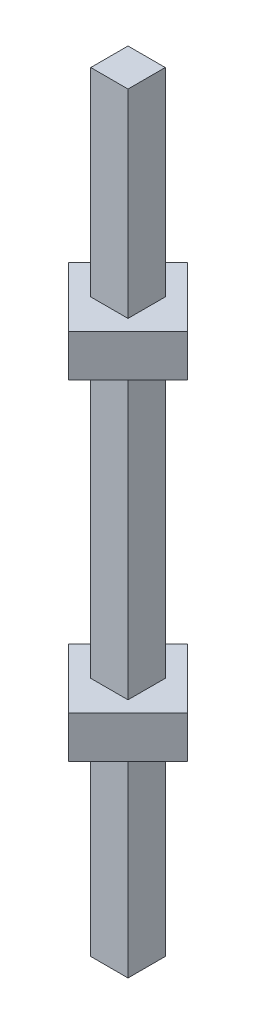
ISO-10303-21;
HEADER;
FILE_DESCRIPTION(('STEP AP214'),'2;1');
FILE_NAME('part.step','',(''),(''),'','','');
FILE_SCHEMA(('AUTOMOTIVE_DESIGN { 1 0 10303 214 1 1 1 1 }'));
ENDSEC;
DATA;
#1=APPLICATION_CONTEXT('core data for automotive mechanical design processes');
#2=APPLICATION_PROTOCOL_DEFINITION('international standard','automotive_design',2000,#1);
#3=PRODUCT_CONTEXT('',#1,'mechanical');
#4=PRODUCT('Part','Part','',(#3));
#5=PRODUCT_RELATED_PRODUCT_CATEGORY('part','',(#4));
#6=PRODUCT_DEFINITION_FORMATION('','',#4);
#7=PRODUCT_DEFINITION_CONTEXT('part definition',#1,'design');
#8=PRODUCT_DEFINITION('design','',#6,#7);
#9=PRODUCT_DEFINITION_SHAPE('','',#8);
#10=(LENGTH_UNIT() NAMED_UNIT(*) SI_UNIT(.MILLI.,.METRE.));
#11=(NAMED_UNIT(*) PLANE_ANGLE_UNIT() SI_UNIT($,.RADIAN.));
#12=(NAMED_UNIT(*) SI_UNIT($,.STERADIAN.) SOLID_ANGLE_UNIT());
#13=UNCERTAINTY_MEASURE_WITH_UNIT(LENGTH_MEASURE(1.E-05),#10,'distance_accuracy_value','');
#14=(GEOMETRIC_REPRESENTATION_CONTEXT(3) GLOBAL_UNCERTAINTY_ASSIGNED_CONTEXT((#13)) GLOBAL_UNIT_ASSIGNED_CONTEXT((#10,
#11,#12)) REPRESENTATION_CONTEXT('',''));
#15=CARTESIAN_POINT('',(0.,0.,0.));
#16=DIRECTION('',(0.,0.,1.));
#17=DIRECTION('',(1.,0.,0.));
#18=AXIS2_PLACEMENT_3D('',#15,#16,#17);
#19=CARTESIAN_POINT('',(0.,310.,-15.));
#20=DIRECTION('',(1.,0.,0.));
#21=DIRECTION('',(0.,0.,-1.));
#22=AXIS2_PLACEMENT_3D('',#19,#20,#21);
#23=PLANE('',#22);
#24=DIRECTION('',(0.,0.,1.));
#25=VECTOR('',#24,1.);
#26=CARTESIAN_POINT('',(0.,213.,-15.));
#27=LINE('',#26,#25);
#28=CARTESIAN_POINT('',(0.,213.,-15.));
#29=VERTEX_POINT('',#28);
#30=CARTESIAN_POINT('',(0.,213.,0.));
#31=VERTEX_POINT('',#30);
#32=EDGE_CURVE('E249',#29,#31,#27,.T.);
#33=ORIENTED_EDGE('',*,*,#32,.F.);
#34=DIRECTION('',(0.,-1.,0.));
#35=VECTOR('',#34,1.);
#36=CARTESIAN_POINT('',(0.,310.,-15.));
#37=LINE('',#36,#35);
#38=CARTESIAN_POINT('',(0.,97.,-15.));
#39=VERTEX_POINT('',#38);
#40=EDGE_CURVE('E356',#29,#39,#37,.T.);
#41=ORIENTED_EDGE('',*,*,#40,.T.);
#42=DIRECTION('',(0.,0.,-1.));
#43=VECTOR('',#42,1.);
#44=CARTESIAN_POINT('',(0.,97.,-15.));
#45=LINE('',#44,#43);
#46=CARTESIAN_POINT('',(0.,97.,0.));
#47=VERTEX_POINT('',#46);
#48=EDGE_CURVE('E317',#47,#39,#45,.T.);
#49=ORIENTED_EDGE('',*,*,#48,.F.);
#50=DIRECTION('',(0.,-1.,0.));
#51=VECTOR('',#50,1.);
#52=CARTESIAN_POINT('',(0.,310.,0.));
#53=LINE('',#52,#51);
#54=EDGE_CURVE('E374',#31,#47,#53,.T.);
#55=ORIENTED_EDGE('',*,*,#54,.F.);
#56=EDGE_LOOP('',(#33,#41,#49,#55));
#57=FACE_BOUND('',#56,.T.);
#58=ADVANCED_FACE('F39',(#57),#23,.F.);
#59=CARTESIAN_POINT('',(0.,310.,0.));
#60=DIRECTION('',(0.,0.,-1.));
#61=DIRECTION('',(-1.,0.,0.));
#62=AXIS2_PLACEMENT_3D('',#59,#60,#61);
#63=PLANE('',#62);
#64=DIRECTION('',(1.,0.,0.));
#65=VECTOR('',#64,1.);
#66=CARTESIAN_POINT('',(0.,213.,0.));
#67=LINE('',#66,#65);
#68=CARTESIAN_POINT('',(15.,213.,0.));
#69=VERTEX_POINT('',#68);
#70=EDGE_CURVE('E55',#31,#69,#67,.T.);
#71=ORIENTED_EDGE('',*,*,#70,.F.);
#72=ORIENTED_EDGE('',*,*,#54,.T.);
#73=DIRECTION('',(-1.,0.,0.));
#74=VECTOR('',#73,1.);
#75=CARTESIAN_POINT('',(0.,97.,0.));
#76=LINE('',#75,#74);
#77=CARTESIAN_POINT('',(15.,97.,0.));
#78=VERTEX_POINT('',#77);
#79=EDGE_CURVE('E313',#78,#47,#76,.T.);
#80=ORIENTED_EDGE('',*,*,#79,.F.);
#81=DIRECTION('',(0.,-1.,0.));
#82=VECTOR('',#81,1.);
#83=CARTESIAN_POINT('',(15.,310.,0.));
#84=LINE('',#83,#82);
#85=EDGE_CURVE('E368',#69,#78,#84,.T.);
#86=ORIENTED_EDGE('',*,*,#85,.F.);
#87=EDGE_LOOP('',(#71,#72,#80,#86));
#88=FACE_BOUND('',#87,.T.);
#89=ADVANCED_FACE('F404',(#88),#63,.F.);
#90=CARTESIAN_POINT('',(15.,310.,0.));
#91=DIRECTION('',(-1.,0.,0.));
#92=DIRECTION('',(0.,0.,1.));
#93=AXIS2_PLACEMENT_3D('',#90,#91,#92);
#94=PLANE('',#93);
#95=DIRECTION('',(0.,0.,-1.));
#96=VECTOR('',#95,1.);
#97=CARTESIAN_POINT('',(15.,213.,0.));
#98=LINE('',#97,#96);
#99=CARTESIAN_POINT('',(15.,213.,-15.));
#100=VERTEX_POINT('',#99);
#101=EDGE_CURVE('E63',#69,#100,#98,.T.);
#102=ORIENTED_EDGE('',*,*,#101,.F.);
#103=ORIENTED_EDGE('',*,*,#85,.T.);
#104=DIRECTION('',(0.,0.,1.));
#105=VECTOR('',#104,1.);
#106=CARTESIAN_POINT('',(15.,97.,0.));
#107=LINE('',#106,#105);
#108=CARTESIAN_POINT('',(15.,97.,-15.));
#109=VERTEX_POINT('',#108);
#110=EDGE_CURVE('E309',#109,#78,#107,.T.);
#111=ORIENTED_EDGE('',*,*,#110,.F.);
#112=DIRECTION('',(0.,-1.,0.));
#113=VECTOR('',#112,1.);
#114=CARTESIAN_POINT('',(15.,310.,-15.));
#115=LINE('',#114,#113);
#116=EDGE_CURVE('E362',#100,#109,#115,.T.);
#117=ORIENTED_EDGE('',*,*,#116,.F.);
#118=EDGE_LOOP('',(#102,#103,#111,#117));
#119=FACE_BOUND('',#118,.T.);
#120=ADVANCED_FACE('F411',(#119),#94,.F.);
#121=CARTESIAN_POINT('',(15.,310.,-15.));
#122=DIRECTION('',(0.,0.,1.));
#123=DIRECTION('',(1.,0.,0.));
#124=AXIS2_PLACEMENT_3D('',#121,#122,#123);
#125=PLANE('',#124);
#126=DIRECTION('',(-1.,0.,0.));
#127=VECTOR('',#126,1.);
#128=CARTESIAN_POINT('',(15.,213.,-15.));
#129=LINE('',#128,#127);
#130=EDGE_CURVE('E11',#100,#29,#129,.T.);
#131=ORIENTED_EDGE('',*,*,#130,.F.);
#132=ORIENTED_EDGE('',*,*,#116,.T.);
#133=DIRECTION('',(1.,0.,0.));
#134=VECTOR('',#133,1.);
#135=CARTESIAN_POINT('',(15.,97.,-15.));
#136=LINE('',#135,#134);
#137=EDGE_CURVE('E378',#39,#109,#136,.T.);
#138=ORIENTED_EDGE('',*,*,#137,.F.);
#139=ORIENTED_EDGE('',*,*,#40,.F.);
#140=EDGE_LOOP('',(#131,#132,#138,#139));
#141=FACE_BOUND('',#140,.T.);
#142=ADVANCED_FACE('F452',(#141),#125,.F.);
#143=CARTESIAN_POINT('',(0.,97.,0.));
#144=DIRECTION('',(0.,-1.,0.));
#145=DIRECTION('',(0.,0.,-1.));
#146=AXIS2_PLACEMENT_3D('',#143,#144,#145);
#147=PLANE('',#146);
#148=DIRECTION('',(0.707106781186547,0.,-0.707106781186548));
#149=VECTOR('',#148,1.);
#150=CARTESIAN_POINT('',(-16.5416305603426,97.,-7.49999999999999));
#151=LINE('',#150,#149);
#152=CARTESIAN_POINT('',(-16.5416305603426,97.,-7.49999999999999));
#153=VERTEX_POINT('',#152);
#154=CARTESIAN_POINT('',(7.49999999999999,97.,-31.5416305603426));
#155=VERTEX_POINT('',#154);
#156=EDGE_CURVE('E254',#153,#155,#151,.T.);
#157=ORIENTED_EDGE('',*,*,#156,.F.);
#158=DIRECTION('',(-0.707106781186548,0.,-0.707106781186547));
#159=VECTOR('',#158,1.);
#160=CARTESIAN_POINT('',(7.5,97.,16.5416305603426));
#161=LINE('',#160,#159);
#162=CARTESIAN_POINT('',(7.5,97.,16.5416305603426));
#163=VERTEX_POINT('',#162);
#164=EDGE_CURVE('E267',#163,#153,#161,.T.);
#165=ORIENTED_EDGE('',*,*,#164,.F.);
#166=DIRECTION('',(-0.707106781186547,0.,0.707106781186548));
#167=VECTOR('',#166,1.);
#168=CARTESIAN_POINT('',(31.5416305603426,97.,-7.5));
#169=LINE('',#168,#167);
#170=CARTESIAN_POINT('',(31.5416305603426,97.,-7.5));
#171=VERTEX_POINT('',#170);
#172=EDGE_CURVE('E263',#171,#163,#169,.T.);
#173=ORIENTED_EDGE('',*,*,#172,.F.);
#174=DIRECTION('',(0.707106781186548,0.,0.707106781186547));
#175=VECTOR('',#174,1.);
#176=CARTESIAN_POINT('',(7.49999999999999,97.,-31.5416305603426));
#177=LINE('',#176,#175);
#178=EDGE_CURVE('E258',#155,#171,#177,.T.);
#179=ORIENTED_EDGE('',*,*,#178,.F.);
#180=EDGE_LOOP('',(#157,#165,#173,#179));
#181=FACE_BOUND('',#180,.T.);
#182=ORIENTED_EDGE('',*,*,#79,.T.);
#183=ORIENTED_EDGE('',*,*,#48,.T.);
#184=ORIENTED_EDGE('',*,*,#137,.T.);
#185=ORIENTED_EDGE('',*,*,#110,.T.);
#186=EDGE_LOOP('',(#182,#183,#184,#185));
#187=FACE_BOUND('',#186,.T.);
#188=ADVANCED_FACE('F436',(#181,#187),#147,.F.);
#189=CARTESIAN_POINT('',(0.,80.,0.));
#190=DIRECTION('',(0.,-1.,0.));
#191=DIRECTION('',(0.,0.,-1.));
#192=AXIS2_PLACEMENT_3D('',#189,#190,#191);
#193=PLANE('',#192);
#194=DIRECTION('',(0.707106781186547,0.,-0.707106781186548));
#195=VECTOR('',#194,1.);
#196=CARTESIAN_POINT('',(-16.5416305603426,80.,-7.49999999999999));
#197=LINE('',#196,#195);
#198=CARTESIAN_POINT('',(-16.5416305603426,80.,-7.49999999999999));
#199=VERTEX_POINT('',#198);
#200=CARTESIAN_POINT('',(7.49999999999999,80.,-31.5416305603426));
#201=VERTEX_POINT('',#200);
#202=EDGE_CURVE('E253',#199,#201,#197,.T.);
#203=ORIENTED_EDGE('',*,*,#202,.T.);
#204=DIRECTION('',(0.707106781186548,0.,0.707106781186547));
#205=VECTOR('',#204,1.);
#206=CARTESIAN_POINT('',(7.49999999999999,80.,-31.5416305603426));
#207=LINE('',#206,#205);
#208=CARTESIAN_POINT('',(31.5416305603426,80.,-7.5));
#209=VERTEX_POINT('',#208);
#210=EDGE_CURVE('E275',#201,#209,#207,.T.);
#211=ORIENTED_EDGE('',*,*,#210,.T.);
#212=DIRECTION('',(-0.707106781186547,0.,0.707106781186548));
#213=VECTOR('',#212,1.);
#214=CARTESIAN_POINT('',(31.5416305603426,80.,-7.5));
#215=LINE('',#214,#213);
#216=CARTESIAN_POINT('',(7.5,80.,16.5416305603426));
#217=VERTEX_POINT('',#216);
#218=EDGE_CURVE('E279',#209,#217,#215,.T.);
#219=ORIENTED_EDGE('',*,*,#218,.T.);
#220=DIRECTION('',(-0.707106781186548,0.,-0.707106781186547));
#221=VECTOR('',#220,1.);
#222=CARTESIAN_POINT('',(7.5,80.,16.5416305603426));
#223=LINE('',#222,#221);
#224=EDGE_CURVE('E259',#217,#199,#223,.T.);
#225=ORIENTED_EDGE('',*,*,#224,.T.);
#226=EDGE_LOOP('',(#203,#211,#219,#225));
#227=FACE_BOUND('',#226,.T.);
#228=DIRECTION('',(0.,0.,-1.));
#229=VECTOR('',#228,1.);
#230=CARTESIAN_POINT('',(0.,80.,-15.));
#231=LINE('',#230,#229);
#232=CARTESIAN_POINT('',(0.,80.,0.));
#233=VERTEX_POINT('',#232);
#234=CARTESIAN_POINT('',(0.,80.,-15.));
#235=VERTEX_POINT('',#234);
#236=EDGE_CURVE('E305',#233,#235,#231,.T.);
#237=ORIENTED_EDGE('',*,*,#236,.F.);
#238=DIRECTION('',(-1.,0.,0.));
#239=VECTOR('',#238,1.);
#240=CARTESIAN_POINT('',(0.,80.,0.));
#241=LINE('',#240,#239);
#242=CARTESIAN_POINT('',(15.,80.,0.));
#243=VERTEX_POINT('',#242);
#244=EDGE_CURVE('E301',#243,#233,#241,.T.);
#245=ORIENTED_EDGE('',*,*,#244,.F.);
#246=DIRECTION('',(0.,0.,1.));
#247=VECTOR('',#246,1.);
#248=CARTESIAN_POINT('',(15.,80.,0.));
#249=LINE('',#248,#247);
#250=CARTESIAN_POINT('',(15.,80.,-15.));
#251=VERTEX_POINT('',#250);
#252=EDGE_CURVE('E289',#251,#243,#249,.T.);
#253=ORIENTED_EDGE('',*,*,#252,.F.);
#254=DIRECTION('',(1.,0.,0.));
#255=VECTOR('',#254,1.);
#256=CARTESIAN_POINT('',(15.,80.,-15.));
#257=LINE('',#256,#255);
#258=EDGE_CURVE('E373',#235,#251,#257,.T.);
#259=ORIENTED_EDGE('',*,*,#258,.F.);
#260=EDGE_LOOP('',(#237,#245,#253,#259));
#261=FACE_BOUND('',#260,.T.);
#262=ADVANCED_FACE('F461',(#227,#261),#193,.T.);
#263=CARTESIAN_POINT('',(-16.5416305603426,97.,-7.49999999999999));
#264=DIRECTION('',(-0.707106781186548,0.,-0.707106781186547));
#265=DIRECTION('',(-0.707106781186547,0.,0.707106781186548));
#266=AXIS2_PLACEMENT_3D('',#263,#264,#265);
#267=PLANE('',#266);
#268=ORIENTED_EDGE('',*,*,#202,.F.);
#269=DIRECTION('',(0.,-1.,0.));
#270=VECTOR('',#269,1.);
#271=CARTESIAN_POINT('',(-16.5416305603426,97.,-7.49999999999999));
#272=LINE('',#271,#270);
#273=EDGE_CURVE('E286',#153,#199,#272,.T.);
#274=ORIENTED_EDGE('',*,*,#273,.F.);
#275=ORIENTED_EDGE('',*,*,#156,.T.);
#276=DIRECTION('',(0.,-1.,0.));
#277=VECTOR('',#276,1.);
#278=CARTESIAN_POINT('',(7.49999999999999,97.,-31.5416305603426));
#279=LINE('',#278,#277);
#280=EDGE_CURVE('E271',#155,#201,#279,.T.);
#281=ORIENTED_EDGE('',*,*,#280,.T.);
#282=EDGE_LOOP('',(#268,#274,#275,#281));
#283=FACE_BOUND('',#282,.T.);
#284=ADVANCED_FACE('F481',(#283),#267,.T.);
#285=CARTESIAN_POINT('',(7.5,97.,16.5416305603426));
#286=DIRECTION('',(-0.707106781186547,0.,0.707106781186548));
#287=DIRECTION('',(0.707106781186548,0.,0.707106781186547));
#288=AXIS2_PLACEMENT_3D('',#285,#286,#287);
#289=PLANE('',#288);
#290=ORIENTED_EDGE('',*,*,#224,.F.);
#291=DIRECTION('',(0.,-1.,0.));
#292=VECTOR('',#291,1.);
#293=CARTESIAN_POINT('',(7.5,97.,16.5416305603426));
#294=LINE('',#293,#292);
#295=EDGE_CURVE('E290',#163,#217,#294,.T.);
#296=ORIENTED_EDGE('',*,*,#295,.F.);
#297=ORIENTED_EDGE('',*,*,#164,.T.);
#298=ORIENTED_EDGE('',*,*,#273,.T.);
#299=EDGE_LOOP('',(#290,#296,#297,#298));
#300=FACE_BOUND('',#299,.T.);
#301=ADVANCED_FACE('F483',(#300),#289,.T.);
#302=CARTESIAN_POINT('',(31.5416305603426,97.,-7.5));
#303=DIRECTION('',(0.707106781186548,0.,0.707106781186547));
#304=DIRECTION('',(0.707106781186547,0.,-0.707106781186548));
#305=AXIS2_PLACEMENT_3D('',#302,#303,#304);
#306=PLANE('',#305);
#307=ORIENTED_EDGE('',*,*,#218,.F.);
#308=DIRECTION('',(0.,-1.,0.));
#309=VECTOR('',#308,1.);
#310=CARTESIAN_POINT('',(31.5416305603426,97.,-7.5));
#311=LINE('',#310,#309);
#312=EDGE_CURVE('E293',#171,#209,#311,.T.);
#313=ORIENTED_EDGE('',*,*,#312,.F.);
#314=ORIENTED_EDGE('',*,*,#172,.T.);
#315=ORIENTED_EDGE('',*,*,#295,.T.);
#316=EDGE_LOOP('',(#307,#313,#314,#315));
#317=FACE_BOUND('',#316,.T.);
#318=ADVANCED_FACE('F475',(#317),#306,.T.);
#319=CARTESIAN_POINT('',(7.49999999999999,97.,-31.5416305603426));
#320=DIRECTION('',(0.707106781186547,0.,-0.707106781186548));
#321=DIRECTION('',(-0.707106781186548,0.,-0.707106781186547));
#322=AXIS2_PLACEMENT_3D('',#319,#320,#321);
#323=PLANE('',#322);
#324=ORIENTED_EDGE('',*,*,#210,.F.);
#325=ORIENTED_EDGE('',*,*,#280,.F.);
#326=ORIENTED_EDGE('',*,*,#178,.T.);
#327=ORIENTED_EDGE('',*,*,#312,.T.);
#328=EDGE_LOOP('',(#324,#325,#326,#327));
#329=FACE_BOUND('',#328,.T.);
#330=ADVANCED_FACE('F471',(#329),#323,.T.);
#331=CARTESIAN_POINT('',(0.,0.,0.));
#332=DIRECTION('',(0.,1.,0.));
#333=DIRECTION('',(0.,0.,1.));
#334=AXIS2_PLACEMENT_3D('',#331,#332,#333);
#335=PLANE('',#334);
#336=DIRECTION('',(0.,0.,1.));
#337=VECTOR('',#336,1.);
#338=CARTESIAN_POINT('',(0.,0.,-15.));
#339=LINE('',#338,#337);
#340=CARTESIAN_POINT('',(0.,0.,-15.));
#341=VERTEX_POINT('',#340);
#342=CARTESIAN_POINT('',(0.,0.,0.));
#343=VERTEX_POINT('',#342);
#344=EDGE_CURVE('E321',#341,#343,#339,.T.);
#345=ORIENTED_EDGE('',*,*,#344,.F.);
#346=DIRECTION('',(-1.,0.,0.));
#347=VECTOR('',#346,1.);
#348=CARTESIAN_POINT('',(15.,0.,-15.));
#349=LINE('',#348,#347);
#350=CARTESIAN_POINT('',(15.,0.,-15.));
#351=VERTEX_POINT('',#350);
#352=EDGE_CURVE('E327',#351,#341,#349,.T.);
#353=ORIENTED_EDGE('',*,*,#352,.F.);
#354=DIRECTION('',(0.,0.,-1.));
#355=VECTOR('',#354,1.);
#356=CARTESIAN_POINT('',(15.,0.,0.));
#357=LINE('',#356,#355);
#358=CARTESIAN_POINT('',(15.,0.,0.));
#359=VERTEX_POINT('',#358);
#360=EDGE_CURVE('E344',#359,#351,#357,.T.);
#361=ORIENTED_EDGE('',*,*,#360,.F.);
#362=DIRECTION('',(1.,0.,0.));
#363=VECTOR('',#362,1.);
#364=CARTESIAN_POINT('',(0.,0.,0.));
#365=LINE('',#364,#363);
#366=EDGE_CURVE('E340',#343,#359,#365,.T.);
#367=ORIENTED_EDGE('',*,*,#366,.F.);
#368=EDGE_LOOP('',(#345,#353,#361,#367));
#369=FACE_BOUND('',#368,.T.);
#370=ADVANCED_FACE('F446',(#369),#335,.F.);
#371=EDGE_CURVE('E336',#235,#341,#37,.T.);
#372=ORIENTED_EDGE('',*,*,#371,.F.);
#373=ORIENTED_EDGE('',*,*,#258,.T.);
#374=EDGE_CURVE('E355',#251,#351,#115,.T.);
#375=ORIENTED_EDGE('',*,*,#374,.T.);
#376=ORIENTED_EDGE('',*,*,#352,.T.);
#377=EDGE_LOOP('',(#372,#373,#375,#376));
#378=FACE_BOUND('',#377,.T.);
#379=ADVANCED_FACE('F448',(#378),#125,.F.);
#380=ORIENTED_EDGE('',*,*,#374,.F.);
#381=ORIENTED_EDGE('',*,*,#252,.T.);
#382=EDGE_CURVE('E361',#243,#359,#84,.T.);
#383=ORIENTED_EDGE('',*,*,#382,.T.);
#384=ORIENTED_EDGE('',*,*,#360,.T.);
#385=EDGE_LOOP('',(#380,#381,#383,#384));
#386=FACE_BOUND('',#385,.T.);
#387=ADVANCED_FACE('F410',(#386),#94,.F.);
#388=ORIENTED_EDGE('',*,*,#382,.F.);
#389=ORIENTED_EDGE('',*,*,#244,.T.);
#390=EDGE_CURVE('E367',#233,#343,#53,.T.);
#391=ORIENTED_EDGE('',*,*,#390,.T.);
#392=ORIENTED_EDGE('',*,*,#366,.T.);
#393=EDGE_LOOP('',(#388,#389,#391,#392));
#394=FACE_BOUND('',#393,.T.);
#395=ADVANCED_FACE('F403',(#394),#63,.F.);
#396=ORIENTED_EDGE('',*,*,#390,.F.);
#397=ORIENTED_EDGE('',*,*,#236,.T.);
#398=ORIENTED_EDGE('',*,*,#371,.T.);
#399=ORIENTED_EDGE('',*,*,#344,.T.);
#400=EDGE_LOOP('',(#396,#397,#398,#399));
#401=FACE_BOUND('',#400,.T.);
#402=ADVANCED_FACE('F41',(#401),#23,.F.);
#403=CARTESIAN_POINT('',(0.,213.,0.));
#404=DIRECTION('',(0.,1.,0.));
#405=DIRECTION('',(0.,0.,1.));
#406=AXIS2_PLACEMENT_3D('',#403,#404,#405);
#407=PLANE('',#406);
#408=DIRECTION('',(-0.707106781186548,0.,-0.707106781186547));
#409=VECTOR('',#408,1.);
#410=CARTESIAN_POINT('',(31.5416305603426,213.,-7.5));
#411=LINE('',#410,#409);
#412=CARTESIAN_POINT('',(31.5416305603426,213.,-7.5));
#413=VERTEX_POINT('',#412);
#414=CARTESIAN_POINT('',(7.49999999999999,213.,-31.5416305603426));
#415=VERTEX_POINT('',#414);
#416=EDGE_CURVE('E198',#413,#415,#411,.T.);
#417=ORIENTED_EDGE('',*,*,#416,.F.);
#418=DIRECTION('',(0.707106781186547,0.,-0.707106781186548));
#419=VECTOR('',#418,1.);
#420=CARTESIAN_POINT('',(7.5,213.,16.5416305603426));
#421=LINE('',#420,#419);
#422=CARTESIAN_POINT('',(7.5,213.,16.5416305603426));
#423=VERTEX_POINT('',#422);
#424=EDGE_CURVE('E190',#423,#413,#421,.T.);
#425=ORIENTED_EDGE('',*,*,#424,.F.);
#426=DIRECTION('',(0.707106781186548,0.,0.707106781186547));
#427=VECTOR('',#426,1.);
#428=CARTESIAN_POINT('',(-16.5416305603426,213.,-7.49999999999999));
#429=LINE('',#428,#427);
#430=CARTESIAN_POINT('',(-16.5416305603426,213.,-7.49999999999999));
#431=VERTEX_POINT('',#430);
#432=EDGE_CURVE('E201',#431,#423,#429,.T.);
#433=ORIENTED_EDGE('',*,*,#432,.F.);
#434=DIRECTION('',(-0.707106781186547,0.,0.707106781186548));
#435=VECTOR('',#434,1.);
#436=CARTESIAN_POINT('',(7.49999999999999,213.,-31.5416305603426));
#437=LINE('',#436,#435);
#438=EDGE_CURVE('E181',#415,#431,#437,.T.);
#439=ORIENTED_EDGE('',*,*,#438,.F.);
#440=EDGE_LOOP('',(#417,#425,#433,#439));
#441=FACE_BOUND('',#440,.T.);
#442=ORIENTED_EDGE('',*,*,#130,.T.);
#443=ORIENTED_EDGE('',*,*,#32,.T.);
#444=ORIENTED_EDGE('',*,*,#70,.T.);
#445=ORIENTED_EDGE('',*,*,#101,.T.);
#446=EDGE_LOOP('',(#442,#443,#444,#445));
#447=FACE_BOUND('',#446,.T.);
#448=ADVANCED_FACE('F195',(#441,#447),#407,.F.);
#449=CARTESIAN_POINT('',(0.,230.,0.));
#450=DIRECTION('',(0.,1.,0.));
#451=DIRECTION('',(0.,0.,1.));
#452=AXIS2_PLACEMENT_3D('',#449,#450,#451);
#453=PLANE('',#452);
#454=DIRECTION('',(-0.707106781186548,0.,-0.707106781186547));
#455=VECTOR('',#454,1.);
#456=CARTESIAN_POINT('',(31.5416305603426,230.,-7.5));
#457=LINE('',#456,#455);
#458=CARTESIAN_POINT('',(31.5416305603426,230.,-7.5));
#459=VERTEX_POINT('',#458);
#460=CARTESIAN_POINT('',(7.49999999999999,230.,-31.5416305603426));
#461=VERTEX_POINT('',#460);
#462=EDGE_CURVE('E218',#459,#461,#457,.T.);
#463=ORIENTED_EDGE('',*,*,#462,.T.);
#464=DIRECTION('',(-0.707106781186547,0.,0.707106781186548));
#465=VECTOR('',#464,1.);
#466=CARTESIAN_POINT('',(7.49999999999999,230.,-31.5416305603426));
#467=LINE('',#466,#465);
#468=CARTESIAN_POINT('',(-16.5416305603426,230.,-7.49999999999999));
#469=VERTEX_POINT('',#468);
#470=EDGE_CURVE('E183',#461,#469,#467,.T.);
#471=ORIENTED_EDGE('',*,*,#470,.T.);
#472=DIRECTION('',(0.707106781186548,0.,0.707106781186547));
#473=VECTOR('',#472,1.);
#474=CARTESIAN_POINT('',(-16.5416305603426,230.,-7.49999999999999));
#475=LINE('',#474,#473);
#476=CARTESIAN_POINT('',(7.5,230.,16.5416305603426));
#477=VERTEX_POINT('',#476);
#478=EDGE_CURVE('E211',#469,#477,#475,.T.);
#479=ORIENTED_EDGE('',*,*,#478,.T.);
#480=DIRECTION('',(0.707106781186547,0.,-0.707106781186548));
#481=VECTOR('',#480,1.);
#482=CARTESIAN_POINT('',(7.5,230.,16.5416305603426));
#483=LINE('',#482,#481);
#484=EDGE_CURVE('E207',#477,#459,#483,.T.);
#485=ORIENTED_EDGE('',*,*,#484,.T.);
#486=EDGE_LOOP('',(#463,#471,#479,#485));
#487=FACE_BOUND('',#486,.T.);
#488=DIRECTION('',(0.,0.,1.));
#489=VECTOR('',#488,1.);
#490=CARTESIAN_POINT('',(0.,230.,-15.));
#491=LINE('',#490,#489);
#492=CARTESIAN_POINT('',(0.,230.,-15.));
#493=VERTEX_POINT('',#492);
#494=CARTESIAN_POINT('',(0.,230.,0.));
#495=VERTEX_POINT('',#494);
#496=EDGE_CURVE('E241',#493,#495,#491,.T.);
#497=ORIENTED_EDGE('',*,*,#496,.F.);
#498=DIRECTION('',(-1.,0.,0.));
#499=VECTOR('',#498,1.);
#500=CARTESIAN_POINT('',(15.,230.,-15.));
#501=LINE('',#500,#499);
#502=CARTESIAN_POINT('',(15.,230.,-15.));
#503=VERTEX_POINT('',#502);
#504=EDGE_CURVE('E48',#503,#493,#501,.T.);
#505=ORIENTED_EDGE('',*,*,#504,.F.);
#506=DIRECTION('',(0.,0.,-1.));
#507=VECTOR('',#506,1.);
#508=CARTESIAN_POINT('',(15.,230.,0.));
#509=LINE('',#508,#507);
#510=CARTESIAN_POINT('',(15.,230.,0.));
#511=VERTEX_POINT('',#510);
#512=EDGE_CURVE('E228',#511,#503,#509,.T.);
#513=ORIENTED_EDGE('',*,*,#512,.F.);
#514=DIRECTION('',(1.,0.,0.));
#515=VECTOR('',#514,1.);
#516=CARTESIAN_POINT('',(0.,230.,0.));
#517=LINE('',#516,#515);
#518=EDGE_CURVE('E237',#495,#511,#517,.T.);
#519=ORIENTED_EDGE('',*,*,#518,.F.);
#520=EDGE_LOOP('',(#497,#505,#513,#519));
#521=FACE_BOUND('',#520,.T.);
#522=ADVANCED_FACE('F399',(#487,#521),#453,.T.);
#523=CARTESIAN_POINT('',(31.5416305603426,213.,-7.5));
#524=DIRECTION('',(0.707106781186547,0.,-0.707106781186548));
#525=DIRECTION('',(-0.707106781186548,0.,-0.707106781186547));
#526=AXIS2_PLACEMENT_3D('',#523,#524,#525);
#527=PLANE('',#526);
#528=ORIENTED_EDGE('',*,*,#462,.F.);
#529=DIRECTION('',(0.,1.,0.));
#530=VECTOR('',#529,1.);
#531=CARTESIAN_POINT('',(31.5416305603426,213.,-7.5));
#532=LINE('',#531,#530);
#533=EDGE_CURVE('E205',#413,#459,#532,.T.);
#534=ORIENTED_EDGE('',*,*,#533,.F.);
#535=ORIENTED_EDGE('',*,*,#416,.T.);
#536=DIRECTION('',(0.,1.,0.));
#537=VECTOR('',#536,1.);
#538=CARTESIAN_POINT('',(7.49999999999999,213.,-31.5416305603426));
#539=LINE('',#538,#537);
#540=EDGE_CURVE('E178',#415,#461,#539,.T.);
#541=ORIENTED_EDGE('',*,*,#540,.T.);
#542=EDGE_LOOP('',(#528,#534,#535,#541));
#543=FACE_BOUND('',#542,.T.);
#544=ADVANCED_FACE('F204',(#543),#527,.T.);
#545=CARTESIAN_POINT('',(7.5,213.,16.5416305603426));
#546=DIRECTION('',(0.707106781186548,0.,0.707106781186547));
#547=DIRECTION('',(0.707106781186547,0.,-0.707106781186548));
#548=AXIS2_PLACEMENT_3D('',#545,#546,#547);
#549=PLANE('',#548);
#550=ORIENTED_EDGE('',*,*,#484,.F.);
#551=DIRECTION('',(0.,1.,0.));
#552=VECTOR('',#551,1.);
#553=CARTESIAN_POINT('',(7.5,213.,16.5416305603426));
#554=LINE('',#553,#552);
#555=EDGE_CURVE('E229',#423,#477,#554,.T.);
#556=ORIENTED_EDGE('',*,*,#555,.F.);
#557=ORIENTED_EDGE('',*,*,#424,.T.);
#558=ORIENTED_EDGE('',*,*,#533,.T.);
#559=EDGE_LOOP('',(#550,#556,#557,#558));
#560=FACE_BOUND('',#559,.T.);
#561=ADVANCED_FACE('F497',(#560),#549,.T.);
#562=CARTESIAN_POINT('',(-16.5416305603426,213.,-7.49999999999999));
#563=DIRECTION('',(-0.707106781186547,0.,0.707106781186548));
#564=DIRECTION('',(0.707106781186548,0.,0.707106781186547));
#565=AXIS2_PLACEMENT_3D('',#562,#563,#564);
#566=PLANE('',#565);
#567=ORIENTED_EDGE('',*,*,#478,.F.);
#568=DIRECTION('',(0.,1.,0.));
#569=VECTOR('',#568,1.);
#570=CARTESIAN_POINT('',(-16.5416305603426,213.,-7.49999999999999));
#571=LINE('',#570,#569);
#572=EDGE_CURVE('E189',#431,#469,#571,.T.);
#573=ORIENTED_EDGE('',*,*,#572,.F.);
#574=ORIENTED_EDGE('',*,*,#432,.T.);
#575=ORIENTED_EDGE('',*,*,#555,.T.);
#576=EDGE_LOOP('',(#567,#573,#574,#575));
#577=FACE_BOUND('',#576,.T.);
#578=ADVANCED_FACE('F500',(#577),#566,.T.);
#579=CARTESIAN_POINT('',(7.49999999999999,213.,-31.5416305603426));
#580=DIRECTION('',(-0.707106781186548,0.,-0.707106781186547));
#581=DIRECTION('',(-0.707106781186547,0.,0.707106781186548));
#582=AXIS2_PLACEMENT_3D('',#579,#580,#581);
#583=PLANE('',#582);
#584=ORIENTED_EDGE('',*,*,#470,.F.);
#585=ORIENTED_EDGE('',*,*,#540,.F.);
#586=ORIENTED_EDGE('',*,*,#438,.T.);
#587=ORIENTED_EDGE('',*,*,#572,.T.);
#588=EDGE_LOOP('',(#584,#585,#586,#587));
#589=FACE_BOUND('',#588,.T.);
#590=ADVANCED_FACE('F180',(#589),#583,.T.);
#591=CARTESIAN_POINT('',(0.,310.,0.));
#592=DIRECTION('',(0.,1.,0.));
#593=DIRECTION('',(0.,0.,1.));
#594=AXIS2_PLACEMENT_3D('',#591,#592,#593);
#595=PLANE('',#594);
#596=DIRECTION('',(0.,0.,1.));
#597=VECTOR('',#596,1.);
#598=CARTESIAN_POINT('',(0.,310.,-15.));
#599=LINE('',#598,#597);
#600=CARTESIAN_POINT('',(0.,310.,-15.));
#601=VERTEX_POINT('',#600);
#602=CARTESIAN_POINT('',(0.,310.,0.));
#603=VERTEX_POINT('',#602);
#604=EDGE_CURVE('E322',#601,#603,#599,.T.);
#605=ORIENTED_EDGE('',*,*,#604,.T.);
#606=DIRECTION('',(1.,0.,0.));
#607=VECTOR('',#606,1.);
#608=CARTESIAN_POINT('',(0.,310.,0.));
#609=LINE('',#608,#607);
#610=CARTESIAN_POINT('',(15.,310.,0.));
#611=VERTEX_POINT('',#610);
#612=EDGE_CURVE('E326',#603,#611,#609,.T.);
#613=ORIENTED_EDGE('',*,*,#612,.T.);
#614=DIRECTION('',(0.,0.,-1.));
#615=VECTOR('',#614,1.);
#616=CARTESIAN_POINT('',(15.,310.,0.));
#617=LINE('',#616,#615);
#618=CARTESIAN_POINT('',(15.,310.,-15.));
#619=VERTEX_POINT('',#618);
#620=EDGE_CURVE('E330',#611,#619,#617,.T.);
#621=ORIENTED_EDGE('',*,*,#620,.T.);
#622=DIRECTION('',(-1.,0.,0.));
#623=VECTOR('',#622,1.);
#624=CARTESIAN_POINT('',(15.,310.,-15.));
#625=LINE('',#624,#623);
#626=EDGE_CURVE('E333',#619,#601,#625,.T.);
#627=ORIENTED_EDGE('',*,*,#626,.T.);
#628=EDGE_LOOP('',(#605,#613,#621,#627));
#629=FACE_BOUND('',#628,.T.);
#630=ADVANCED_FACE('F394',(#629),#595,.T.);
#631=EDGE_CURVE('E357',#619,#503,#115,.T.);
#632=ORIENTED_EDGE('',*,*,#631,.T.);
#633=ORIENTED_EDGE('',*,*,#504,.T.);
#634=EDGE_CURVE('E351',#601,#493,#37,.T.);
#635=ORIENTED_EDGE('',*,*,#634,.F.);
#636=ORIENTED_EDGE('',*,*,#626,.F.);
#637=EDGE_LOOP('',(#632,#633,#635,#636));
#638=FACE_BOUND('',#637,.T.);
#639=ADVANCED_FACE('F385',(#638),#125,.F.);
#640=EDGE_CURVE('E363',#611,#511,#84,.T.);
#641=ORIENTED_EDGE('',*,*,#640,.T.);
#642=ORIENTED_EDGE('',*,*,#512,.T.);
#643=ORIENTED_EDGE('',*,*,#631,.F.);
#644=ORIENTED_EDGE('',*,*,#620,.F.);
#645=EDGE_LOOP('',(#641,#642,#643,#644));
#646=FACE_BOUND('',#645,.T.);
#647=ADVANCED_FACE('F398',(#646),#94,.F.);
#648=EDGE_CURVE('E369',#603,#495,#53,.T.);
#649=ORIENTED_EDGE('',*,*,#648,.T.);
#650=ORIENTED_EDGE('',*,*,#518,.T.);
#651=ORIENTED_EDGE('',*,*,#640,.F.);
#652=ORIENTED_EDGE('',*,*,#612,.F.);
#653=EDGE_LOOP('',(#649,#650,#651,#652));
#654=FACE_BOUND('',#653,.T.);
#655=ADVANCED_FACE('F401',(#654),#63,.F.);
#656=ORIENTED_EDGE('',*,*,#634,.T.);
#657=ORIENTED_EDGE('',*,*,#496,.T.);
#658=ORIENTED_EDGE('',*,*,#648,.F.);
#659=ORIENTED_EDGE('',*,*,#604,.F.);
#660=EDGE_LOOP('',(#656,#657,#658,#659));
#661=FACE_BOUND('',#660,.T.);
#662=ADVANCED_FACE('F391',(#661),#23,.F.);
#663=CLOSED_SHELL('',(#58,#89,#120,#142,#188,#262,#284,#301,#318,#330,#370,#379,#387,#395,#402,
#448,#522,#544,#561,#578,#590,#630,#639,#647,#655,#662));
#664=MANIFOLD_SOLID_BREP('B2',#663);
#665=ADVANCED_BREP_SHAPE_REPRESENTATION('',(#18,#664),#14);
#666=SHAPE_DEFINITION_REPRESENTATION(#9,#665);
ENDSEC;
END-ISO-10303-21;
